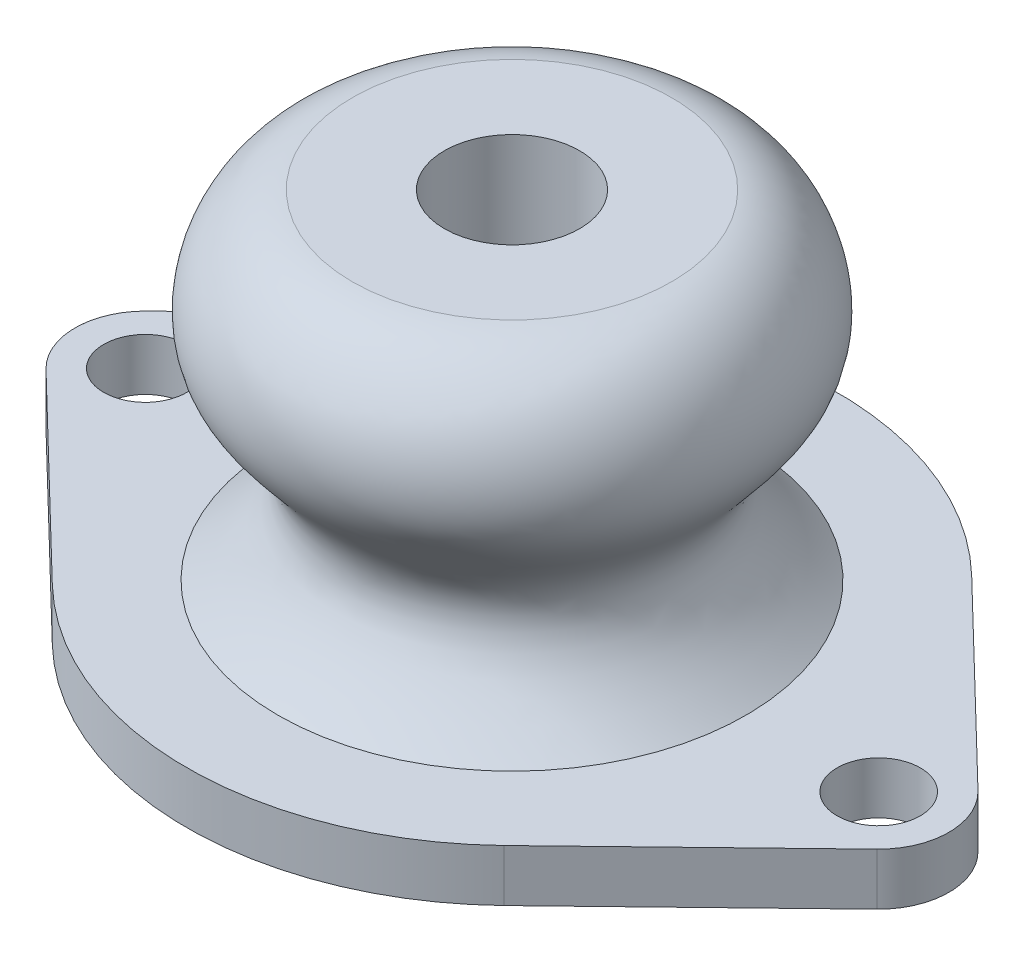
ISO-10303-21;
HEADER;
FILE_DESCRIPTION(('STEP AP214'),'2;1');
FILE_NAME('part.step','',(''),(''),'','','');
FILE_SCHEMA(('AUTOMOTIVE_DESIGN { 1 0 10303 214 1 1 1 1 }'));
ENDSEC;
DATA;
#1=APPLICATION_CONTEXT('core data for automotive mechanical design processes');
#2=APPLICATION_PROTOCOL_DEFINITION('international standard','automotive_design',2000,#1);
#3=PRODUCT_CONTEXT('',#1,'mechanical');
#4=PRODUCT('Part','Part','',(#3));
#5=PRODUCT_RELATED_PRODUCT_CATEGORY('part','',(#4));
#6=PRODUCT_DEFINITION_FORMATION('','',#4);
#7=PRODUCT_DEFINITION_CONTEXT('part definition',#1,'design');
#8=PRODUCT_DEFINITION('design','',#6,#7);
#9=PRODUCT_DEFINITION_SHAPE('','',#8);
#10=(LENGTH_UNIT() NAMED_UNIT(*) SI_UNIT(.MILLI.,.METRE.));
#11=(NAMED_UNIT(*) PLANE_ANGLE_UNIT() SI_UNIT($,.RADIAN.));
#12=(NAMED_UNIT(*) SI_UNIT($,.STERADIAN.) SOLID_ANGLE_UNIT());
#13=UNCERTAINTY_MEASURE_WITH_UNIT(LENGTH_MEASURE(1.E-05),#10,'distance_accuracy_value','');
#14=(GEOMETRIC_REPRESENTATION_CONTEXT(3) GLOBAL_UNCERTAINTY_ASSIGNED_CONTEXT((#13)) GLOBAL_UNIT_ASSIGNED_CONTEXT((#10,
#11,#12)) REPRESENTATION_CONTEXT('',''));
#15=CARTESIAN_POINT('',(0.,0.,0.));
#16=DIRECTION('',(0.,0.,1.));
#17=DIRECTION('',(1.,0.,0.));
#18=AXIS2_PLACEMENT_3D('',#15,#16,#17);
#19=CARTESIAN_POINT('',(-17.907,2.54,0.));
#20=DIRECTION('',(0.,1.,0.));
#21=DIRECTION('',(0.,0.,1.));
#22=AXIS2_PLACEMENT_3D('',#19,#20,#21);
#23=PLANE('',#22);
#24=CARTESIAN_POINT('',(-17.907,2.54,0.));
#25=DIRECTION('',(0.,1.,0.));
#26=DIRECTION('',(0.,0.,1.));
#27=AXIS2_PLACEMENT_3D('',#24,#25,#26);
#28=CIRCLE('',#27,2.032);
#29=CARTESIAN_POINT('',(-17.907,2.54,2.032));
#30=VERTEX_POINT('',#29);
#31=EDGE_CURVE('E139',#30,#30,#28,.T.);
#32=ORIENTED_EDGE('',*,*,#31,.F.);
#33=EDGE_LOOP('',(#32));
#34=FACE_BOUND('',#33,.T.);
#35=CARTESIAN_POINT('',(-17.907,2.54,0.));
#36=DIRECTION('',(0.,1.,0.));
#37=DIRECTION('',(0.,0.,1.));
#38=AXIS2_PLACEMENT_3D('',#35,#36,#37);
#39=CIRCLE('',#38,3.429);
#40=CARTESIAN_POINT('',(-20.2902765957447,2.54,-2.46536684251566));
#41=VERTEX_POINT('',#40);
#42=CARTESIAN_POINT('',(-20.2902765957447,2.54,2.46536684251566));
#43=VERTEX_POINT('',#42);
#44=EDGE_CURVE('E150',#41,#43,#39,.T.);
#45=ORIENTED_EDGE('',*,*,#44,.T.);
#46=DIRECTION('',(0.718975457134926,0.,0.695035460992908));
#47=VECTOR('',#46,1.);
#48=CARTESIAN_POINT('',(-20.2902765957447,2.54,2.46536684251566));
#49=LINE('',#48,#47);
#50=CARTESIAN_POINT('',(-11.0336879432624,2.54,11.4137353820169));
#51=VERTEX_POINT('',#50);
#52=EDGE_CURVE('E98',#43,#51,#49,.T.);
#53=ORIENTED_EDGE('',*,*,#52,.T.);
#54=CARTESIAN_POINT('',(0.,2.54,0.));
#55=DIRECTION('',(0.,1.,0.));
#56=DIRECTION('',(0.,0.,1.));
#57=AXIS2_PLACEMENT_3D('',#54,#55,#56);
#58=CIRCLE('',#57,15.875);
#59=CARTESIAN_POINT('',(11.0336879432624,2.54,11.413735382017));
#60=VERTEX_POINT('',#59);
#61=EDGE_CURVE('E215',#51,#60,#58,.T.);
#62=ORIENTED_EDGE('',*,*,#61,.T.);
#63=DIRECTION('',(0.718975457134926,0.,-0.695035460992908));
#64=VECTOR('',#63,1.);
#65=CARTESIAN_POINT('',(11.0336879432624,2.54,11.413735382017));
#66=LINE('',#65,#64);
#67=CARTESIAN_POINT('',(20.2902765957447,2.54,2.46536684251566));
#68=VERTEX_POINT('',#67);
#69=EDGE_CURVE('E221',#60,#68,#66,.T.);
#70=ORIENTED_EDGE('',*,*,#69,.T.);
#71=CARTESIAN_POINT('',(17.907,2.54,0.));
#72=DIRECTION('',(0.,1.,0.));
#73=DIRECTION('',(0.,0.,1.));
#74=AXIS2_PLACEMENT_3D('',#71,#72,#73);
#75=CIRCLE('',#74,3.429);
#76=CARTESIAN_POINT('',(20.2902765957447,2.54,-2.46536684251566));
#77=VERTEX_POINT('',#76);
#78=EDGE_CURVE('E117',#68,#77,#75,.T.);
#79=ORIENTED_EDGE('',*,*,#78,.T.);
#80=DIRECTION('',(-0.718975457134926,0.,-0.695035460992908));
#81=VECTOR('',#80,1.);
#82=CARTESIAN_POINT('',(20.2902765957447,2.54,-2.46536684251566));
#83=LINE('',#82,#81);
#84=CARTESIAN_POINT('',(11.0336879432624,2.54,-11.413735382017));
#85=VERTEX_POINT('',#84);
#86=EDGE_CURVE('E111',#77,#85,#83,.T.);
#87=ORIENTED_EDGE('',*,*,#86,.T.);
#88=CARTESIAN_POINT('',(0.,2.54,0.));
#89=DIRECTION('',(0.,1.,0.));
#90=DIRECTION('',(0.,0.,1.));
#91=AXIS2_PLACEMENT_3D('',#88,#89,#90);
#92=CIRCLE('',#91,15.875);
#93=CARTESIAN_POINT('',(-11.0336879432624,2.54,-11.413735382017));
#94=VERTEX_POINT('',#93);
#95=EDGE_CURVE('E115',#85,#94,#92,.T.);
#96=ORIENTED_EDGE('',*,*,#95,.T.);
#97=DIRECTION('',(-0.718975457134926,0.,0.695035460992908));
#98=VECTOR('',#97,1.);
#99=CARTESIAN_POINT('',(-20.2902765957447,2.54,-2.46536684251566));
#100=LINE('',#99,#98);
#101=EDGE_CURVE('E54',#94,#41,#100,.T.);
#102=ORIENTED_EDGE('',*,*,#101,.T.);
#103=EDGE_LOOP('',(#45,#53,#62,#70,#79,#87,#96,#102));
#104=FACE_BOUND('',#103,.T.);
#105=CARTESIAN_POINT('',(17.907,2.54,0.));
#106=DIRECTION('',(0.,1.,0.));
#107=DIRECTION('',(0.,0.,1.));
#108=AXIS2_PLACEMENT_3D('',#105,#106,#107);
#109=CIRCLE('',#108,2.032);
#110=CARTESIAN_POINT('',(17.907,2.54,2.03199999999999));
#111=VERTEX_POINT('',#110);
#112=EDGE_CURVE('E230',#111,#111,#109,.T.);
#113=ORIENTED_EDGE('',*,*,#112,.F.);
#114=EDGE_LOOP('',(#113));
#115=FACE_BOUND('',#114,.T.);
#116=CARTESIAN_POINT('',(0.,2.54,0.));
#117=DIRECTION('',(0.,1.,0.));
#118=DIRECTION('',(0.,0.,1.));
#119=AXIS2_PLACEMENT_3D('',#116,#117,#118);
#120=CIRCLE('',#119,11.43);
#121=CARTESIAN_POINT('',(0.,2.54,11.43));
#122=VERTEX_POINT('',#121);
#123=EDGE_CURVE('E11',#122,#122,#120,.T.);
#124=ORIENTED_EDGE('',*,*,#123,.F.);
#125=EDGE_LOOP('',(#124));
#126=FACE_BOUND('',#125,.T.);
#127=ADVANCED_FACE('F37',(#34,#104,#115,#126),#23,.T.);
#128=CARTESIAN_POINT('',(0.,2.54,0.));
#129=DIRECTION('',(0.,1.,0.));
#130=DIRECTION('',(0.,0.,1.));
#131=AXIS2_PLACEMENT_3D('',#128,#129,#130);
#132=CIRCLE('',#131,3.302);
#133=CARTESIAN_POINT('',(0.,2.54,3.302));
#134=VERTEX_POINT('',#133);
#135=EDGE_CURVE('E236',#134,#134,#132,.T.);
#136=ORIENTED_EDGE('',*,*,#135,.F.);
#137=EDGE_LOOP('',(#136));
#138=FACE_BOUND('',#137,.T.);
#139=CARTESIAN_POINT('',(0.,2.54,0.));
#140=DIRECTION('',(0.,1.,0.));
#141=DIRECTION('',(0.,0.,1.));
#142=AXIS2_PLACEMENT_3D('',#139,#140,#141);
#143=CIRCLE('',#142,7.62);
#144=CARTESIAN_POINT('',(0.,2.54,7.62));
#145=VERTEX_POINT('',#144);
#146=EDGE_CURVE('E46',#145,#145,#143,.F.);
#147=ORIENTED_EDGE('',*,*,#146,.F.);
#148=EDGE_LOOP('',(#147));
#149=FACE_BOUND('',#148,.T.);
#150=ADVANCED_FACE('F169',(#138,#149),#23,.T.);
#151=CARTESIAN_POINT('',(-17.907,0.,0.));
#152=DIRECTION('',(0.,1.,0.));
#153=DIRECTION('',(0.,0.,1.));
#154=AXIS2_PLACEMENT_3D('',#151,#152,#153);
#155=PLANE('',#154);
#156=CARTESIAN_POINT('',(-17.907,0.,0.));
#157=DIRECTION('',(0.,1.,0.));
#158=DIRECTION('',(0.,0.,1.));
#159=AXIS2_PLACEMENT_3D('',#156,#157,#158);
#160=CIRCLE('',#159,3.429);
#161=CARTESIAN_POINT('',(-20.2902765957447,0.,-2.46536684251566));
#162=VERTEX_POINT('',#161);
#163=CARTESIAN_POINT('',(-20.2902765957447,0.,2.46536684251566));
#164=VERTEX_POINT('',#163);
#165=EDGE_CURVE('E135',#162,#164,#160,.T.);
#166=ORIENTED_EDGE('',*,*,#165,.F.);
#167=DIRECTION('',(-0.718975457134926,0.,0.695035460992908));
#168=VECTOR('',#167,1.);
#169=CARTESIAN_POINT('',(-20.2902765957447,0.,-2.46536684251566));
#170=LINE('',#169,#168);
#171=CARTESIAN_POINT('',(-11.0336879432624,0.,-11.413735382017));
#172=VERTEX_POINT('',#171);
#173=EDGE_CURVE('E89',#172,#162,#170,.T.);
#174=ORIENTED_EDGE('',*,*,#173,.F.);
#175=CARTESIAN_POINT('',(0.,0.,0.));
#176=DIRECTION('',(0.,1.,0.));
#177=DIRECTION('',(0.,0.,1.));
#178=AXIS2_PLACEMENT_3D('',#175,#176,#177);
#179=CIRCLE('',#178,15.875);
#180=CARTESIAN_POINT('',(11.0336879432624,0.,-11.413735382017));
#181=VERTEX_POINT('',#180);
#182=EDGE_CURVE('E83',#181,#172,#179,.T.);
#183=ORIENTED_EDGE('',*,*,#182,.F.);
#184=DIRECTION('',(-0.718975457134926,0.,-0.695035460992908));
#185=VECTOR('',#184,1.);
#186=CARTESIAN_POINT('',(20.2902765957447,0.,-2.46536684251566));
#187=LINE('',#186,#185);
#188=CARTESIAN_POINT('',(20.2902765957447,0.,-2.46536684251566));
#189=VERTEX_POINT('',#188);
#190=EDGE_CURVE('E125',#189,#181,#187,.T.);
#191=ORIENTED_EDGE('',*,*,#190,.F.);
#192=CARTESIAN_POINT('',(17.907,0.,0.));
#193=DIRECTION('',(0.,1.,0.));
#194=DIRECTION('',(0.,0.,1.));
#195=AXIS2_PLACEMENT_3D('',#192,#193,#194);
#196=CIRCLE('',#195,3.429);
#197=CARTESIAN_POINT('',(20.2902765957447,0.,2.46536684251566));
#198=VERTEX_POINT('',#197);
#199=EDGE_CURVE('E145',#198,#189,#196,.T.);
#200=ORIENTED_EDGE('',*,*,#199,.F.);
#201=DIRECTION('',(0.718975457134926,0.,-0.695035460992908));
#202=VECTOR('',#201,1.);
#203=CARTESIAN_POINT('',(11.0336879432624,0.,11.413735382017));
#204=LINE('',#203,#202);
#205=CARTESIAN_POINT('',(11.0336879432624,0.,11.413735382017));
#206=VERTEX_POINT('',#205);
#207=EDGE_CURVE('E143',#206,#198,#204,.T.);
#208=ORIENTED_EDGE('',*,*,#207,.F.);
#209=CARTESIAN_POINT('',(0.,0.,0.));
#210=DIRECTION('',(0.,1.,0.));
#211=DIRECTION('',(0.,0.,1.));
#212=AXIS2_PLACEMENT_3D('',#209,#210,#211);
#213=CIRCLE('',#212,15.875);
#214=CARTESIAN_POINT('',(-11.0336879432624,0.,11.4137353820169));
#215=VERTEX_POINT('',#214);
#216=EDGE_CURVE('E141',#215,#206,#213,.T.);
#217=ORIENTED_EDGE('',*,*,#216,.F.);
#218=DIRECTION('',(0.718975457134926,0.,0.695035460992908));
#219=VECTOR('',#218,1.);
#220=CARTESIAN_POINT('',(-20.2902765957447,0.,2.46536684251566));
#221=LINE('',#220,#219);
#222=EDGE_CURVE('E138',#164,#215,#221,.T.);
#223=ORIENTED_EDGE('',*,*,#222,.F.);
#224=EDGE_LOOP('',(#166,#174,#183,#191,#200,#208,#217,#223));
#225=FACE_BOUND('',#224,.T.);
#226=CARTESIAN_POINT('',(-17.907,0.,0.));
#227=DIRECTION('',(0.,1.,0.));
#228=DIRECTION('',(0.,0.,1.));
#229=AXIS2_PLACEMENT_3D('',#226,#227,#228);
#230=CIRCLE('',#229,2.032);
#231=CARTESIAN_POINT('',(-17.907,0.,2.032));
#232=VERTEX_POINT('',#231);
#233=EDGE_CURVE('E227',#232,#232,#230,.T.);
#234=ORIENTED_EDGE('',*,*,#233,.T.);
#235=EDGE_LOOP('',(#234));
#236=FACE_BOUND('',#235,.T.);
#237=CARTESIAN_POINT('',(17.907,0.,0.));
#238=DIRECTION('',(0.,1.,0.));
#239=DIRECTION('',(0.,0.,1.));
#240=AXIS2_PLACEMENT_3D('',#237,#238,#239);
#241=CIRCLE('',#240,2.032);
#242=CARTESIAN_POINT('',(17.907,0.,2.03199999999999));
#243=VERTEX_POINT('',#242);
#244=EDGE_CURVE('E233',#243,#243,#241,.T.);
#245=ORIENTED_EDGE('',*,*,#244,.T.);
#246=EDGE_LOOP('',(#245));
#247=FACE_BOUND('',#246,.T.);
#248=CARTESIAN_POINT('',(0.,0.,0.));
#249=DIRECTION('',(0.,1.,0.));
#250=DIRECTION('',(0.,0.,1.));
#251=AXIS2_PLACEMENT_3D('',#248,#249,#250);
#252=CIRCLE('',#251,3.302);
#253=CARTESIAN_POINT('',(0.,0.,3.302));
#254=VERTEX_POINT('',#253);
#255=EDGE_CURVE('E239',#254,#254,#252,.T.);
#256=ORIENTED_EDGE('',*,*,#255,.T.);
#257=EDGE_LOOP('',(#256));
#258=FACE_BOUND('',#257,.T.);
#259=ADVANCED_FACE('F171',(#225,#236,#247,#258),#155,.F.);
#260=CARTESIAN_POINT('',(-17.907,2.54,0.));
#261=DIRECTION('',(0.,-1.,0.));
#262=DIRECTION('',(0.,0.,-1.));
#263=AXIS2_PLACEMENT_3D('',#260,#261,#262);
#264=CYLINDRICAL_SURFACE('',#263,3.429);
#265=ORIENTED_EDGE('',*,*,#165,.T.);
#266=DIRECTION('',(0.,-1.,0.));
#267=VECTOR('',#266,1.);
#268=CARTESIAN_POINT('',(-20.2902765957447,2.54,2.46536684251566));
#269=LINE('',#268,#267);
#270=EDGE_CURVE('E163',#43,#164,#269,.T.);
#271=ORIENTED_EDGE('',*,*,#270,.F.);
#272=ORIENTED_EDGE('',*,*,#44,.F.);
#273=DIRECTION('',(0.,-1.,0.));
#274=VECTOR('',#273,1.);
#275=CARTESIAN_POINT('',(-20.2902765957447,2.54,-2.46536684251566));
#276=LINE('',#275,#274);
#277=EDGE_CURVE('E131',#41,#162,#276,.T.);
#278=ORIENTED_EDGE('',*,*,#277,.T.);
#279=EDGE_LOOP('',(#265,#271,#272,#278));
#280=FACE_BOUND('',#279,.T.);
#281=ADVANCED_FACE('F39',(#280),#264,.T.);
#282=CARTESIAN_POINT('',(-20.2902765957447,2.54,2.46536684251566));
#283=DIRECTION('',(0.695035460992908,0.,-0.718975457134926));
#284=DIRECTION('',(-0.718975457134926,0.,-0.695035460992908));
#285=AXIS2_PLACEMENT_3D('',#282,#283,#284);
#286=PLANE('',#285);
#287=ORIENTED_EDGE('',*,*,#222,.T.);
#288=DIRECTION('',(0.,-1.,0.));
#289=VECTOR('',#288,1.);
#290=CARTESIAN_POINT('',(-11.0336879432624,2.54,11.4137353820169));
#291=LINE('',#290,#289);
#292=EDGE_CURVE('E160',#51,#215,#291,.T.);
#293=ORIENTED_EDGE('',*,*,#292,.F.);
#294=ORIENTED_EDGE('',*,*,#52,.F.);
#295=ORIENTED_EDGE('',*,*,#270,.T.);
#296=EDGE_LOOP('',(#287,#293,#294,#295));
#297=FACE_BOUND('',#296,.T.);
#298=ADVANCED_FACE('F203',(#297),#286,.F.);
#299=CARTESIAN_POINT('',(0.,2.54,0.));
#300=DIRECTION('',(0.,-1.,0.));
#301=DIRECTION('',(0.,0.,-1.));
#302=AXIS2_PLACEMENT_3D('',#299,#300,#301);
#303=CYLINDRICAL_SURFACE('',#302,15.875);
#304=ORIENTED_EDGE('',*,*,#216,.T.);
#305=DIRECTION('',(0.,-1.,0.));
#306=VECTOR('',#305,1.);
#307=CARTESIAN_POINT('',(11.0336879432624,2.54,11.413735382017));
#308=LINE('',#307,#306);
#309=EDGE_CURVE('E157',#60,#206,#308,.T.);
#310=ORIENTED_EDGE('',*,*,#309,.F.);
#311=ORIENTED_EDGE('',*,*,#61,.F.);
#312=ORIENTED_EDGE('',*,*,#292,.T.);
#313=EDGE_LOOP('',(#304,#310,#311,#312));
#314=FACE_BOUND('',#313,.T.);
#315=ADVANCED_FACE('F200',(#314),#303,.T.);
#316=CARTESIAN_POINT('',(11.0336879432624,2.54,11.413735382017));
#317=DIRECTION('',(-0.695035460992908,0.,-0.718975457134926));
#318=DIRECTION('',(-0.718975457134926,0.,0.695035460992908));
#319=AXIS2_PLACEMENT_3D('',#316,#317,#318);
#320=PLANE('',#319);
#321=ORIENTED_EDGE('',*,*,#207,.T.);
#322=DIRECTION('',(0.,-1.,0.));
#323=VECTOR('',#322,1.);
#324=CARTESIAN_POINT('',(20.2902765957447,2.54,2.46536684251566));
#325=LINE('',#324,#323);
#326=EDGE_CURVE('E154',#68,#198,#325,.T.);
#327=ORIENTED_EDGE('',*,*,#326,.F.);
#328=ORIENTED_EDGE('',*,*,#69,.F.);
#329=ORIENTED_EDGE('',*,*,#309,.T.);
#330=EDGE_LOOP('',(#321,#327,#328,#329));
#331=FACE_BOUND('',#330,.T.);
#332=ADVANCED_FACE('F196',(#331),#320,.F.);
#333=CARTESIAN_POINT('',(17.907,2.54,0.));
#334=DIRECTION('',(0.,-1.,0.));
#335=DIRECTION('',(0.,0.,-1.));
#336=AXIS2_PLACEMENT_3D('',#333,#334,#335);
#337=CYLINDRICAL_SURFACE('',#336,3.429);
#338=ORIENTED_EDGE('',*,*,#199,.T.);
#339=DIRECTION('',(0.,-1.,0.));
#340=VECTOR('',#339,1.);
#341=CARTESIAN_POINT('',(20.2902765957447,2.54,-2.46536684251566));
#342=LINE('',#341,#340);
#343=EDGE_CURVE('E126',#77,#189,#342,.T.);
#344=ORIENTED_EDGE('',*,*,#343,.F.);
#345=ORIENTED_EDGE('',*,*,#78,.F.);
#346=ORIENTED_EDGE('',*,*,#326,.T.);
#347=EDGE_LOOP('',(#338,#344,#345,#346));
#348=FACE_BOUND('',#347,.T.);
#349=ADVANCED_FACE('F193',(#348),#337,.T.);
#350=CARTESIAN_POINT('',(20.2902765957447,2.54,-2.46536684251566));
#351=DIRECTION('',(-0.695035460992908,0.,0.718975457134926));
#352=DIRECTION('',(0.718975457134926,0.,0.695035460992908));
#353=AXIS2_PLACEMENT_3D('',#350,#351,#352);
#354=PLANE('',#353);
#355=ORIENTED_EDGE('',*,*,#190,.T.);
#356=DIRECTION('',(0.,-1.,0.));
#357=VECTOR('',#356,1.);
#358=CARTESIAN_POINT('',(11.0336879432624,2.54,-11.413735382017));
#359=LINE('',#358,#357);
#360=EDGE_CURVE('E122',#85,#181,#359,.T.);
#361=ORIENTED_EDGE('',*,*,#360,.F.);
#362=ORIENTED_EDGE('',*,*,#86,.F.);
#363=ORIENTED_EDGE('',*,*,#343,.T.);
#364=EDGE_LOOP('',(#355,#361,#362,#363));
#365=FACE_BOUND('',#364,.T.);
#366=ADVANCED_FACE('F123',(#365),#354,.F.);
#367=CARTESIAN_POINT('',(0.,2.54,0.));
#368=DIRECTION('',(0.,-1.,0.));
#369=DIRECTION('',(0.,0.,-1.));
#370=AXIS2_PLACEMENT_3D('',#367,#368,#369);
#371=CYLINDRICAL_SURFACE('',#370,15.875);
#372=ORIENTED_EDGE('',*,*,#182,.T.);
#373=DIRECTION('',(0.,-1.,0.));
#374=VECTOR('',#373,1.);
#375=CARTESIAN_POINT('',(-11.0336879432624,2.54,-11.413735382017));
#376=LINE('',#375,#374);
#377=EDGE_CURVE('E127',#94,#172,#376,.T.);
#378=ORIENTED_EDGE('',*,*,#377,.F.);
#379=ORIENTED_EDGE('',*,*,#95,.F.);
#380=ORIENTED_EDGE('',*,*,#360,.T.);
#381=EDGE_LOOP('',(#372,#378,#379,#380));
#382=FACE_BOUND('',#381,.T.);
#383=ADVANCED_FACE('F129',(#382),#371,.T.);
#384=CARTESIAN_POINT('',(-20.2902765957447,2.54,-2.46536684251566));
#385=DIRECTION('',(0.695035460992908,0.,0.718975457134926));
#386=DIRECTION('',(0.718975457134926,0.,-0.695035460992908));
#387=AXIS2_PLACEMENT_3D('',#384,#385,#386);
#388=PLANE('',#387);
#389=ORIENTED_EDGE('',*,*,#173,.T.);
#390=ORIENTED_EDGE('',*,*,#277,.F.);
#391=ORIENTED_EDGE('',*,*,#101,.F.);
#392=ORIENTED_EDGE('',*,*,#377,.T.);
#393=EDGE_LOOP('',(#389,#390,#391,#392));
#394=FACE_BOUND('',#393,.T.);
#395=ADVANCED_FACE('F186',(#394),#388,.F.);
#396=CARTESIAN_POINT('',(-17.907,2.54,0.));
#397=DIRECTION('',(0.,-1.,0.));
#398=DIRECTION('',(0.,0.,-1.));
#399=AXIS2_PLACEMENT_3D('',#396,#397,#398);
#400=CYLINDRICAL_SURFACE('',#399,2.032);
#401=ORIENTED_EDGE('',*,*,#31,.T.);
#402=EDGE_LOOP('',(#401));
#403=FACE_BOUND('',#402,.T.);
#404=ORIENTED_EDGE('',*,*,#233,.F.);
#405=EDGE_LOOP('',(#404));
#406=FACE_BOUND('',#405,.T.);
#407=ADVANCED_FACE('F183',(#403,#406),#400,.F.);
#408=CARTESIAN_POINT('',(17.907,2.54,0.));
#409=DIRECTION('',(0.,-1.,0.));
#410=DIRECTION('',(0.,0.,-1.));
#411=AXIS2_PLACEMENT_3D('',#408,#409,#410);
#412=CYLINDRICAL_SURFACE('',#411,2.032);
#413=ORIENTED_EDGE('',*,*,#112,.T.);
#414=EDGE_LOOP('',(#413));
#415=FACE_BOUND('',#414,.T.);
#416=ORIENTED_EDGE('',*,*,#244,.F.);
#417=EDGE_LOOP('',(#416));
#418=FACE_BOUND('',#417,.T.);
#419=ADVANCED_FACE('F272',(#415,#418),#412,.F.);
#420=CARTESIAN_POINT('',(0.,2.54,0.));
#421=DIRECTION('',(0.,-1.,0.));
#422=DIRECTION('',(0.,0.,-1.));
#423=AXIS2_PLACEMENT_3D('',#420,#421,#422);
#424=CYLINDRICAL_SURFACE('',#423,3.302);
#425=ORIENTED_EDGE('',*,*,#135,.T.);
#426=EDGE_LOOP('',(#425));
#427=FACE_BOUND('',#426,.T.);
#428=ORIENTED_EDGE('',*,*,#255,.F.);
#429=EDGE_LOOP('',(#428));
#430=FACE_BOUND('',#429,.T.);
#431=ADVANCED_FACE('F268',(#427,#430),#424,.F.);
#432=CARTESIAN_POINT('',(0.,19.05,7.79499801170627));
#433=CARTESIAN_POINT('',(0.,18.6451014393789,10.7405967893086));
#434=CARTESIAN_POINT('',(0.,10.3958577779326,14.519445993201));
#435=CARTESIAN_POINT('',(0.,7.7619636433784,5.01849851163103));
#436=CARTESIAN_POINT('',(0.,2.54,11.43));
#437=B_SPLINE_CURVE_WITH_KNOTS('',3,(#432,#433,#434,#435,#436),.UNSPECIFIED.,.F.,.F.,(4,1,4),
(0.,0.449937677339743,1.),.UNSPECIFIED.);
#438=CARTESIAN_POINT('',(0.,19.05,0.));
#439=DIRECTION('',(0.,1.,0.));
#440=AXIS1_PLACEMENT('',#438,#439);
#441=SURFACE_OF_REVOLUTION('',#437,#440);
#442=ORIENTED_EDGE('',*,*,#123,.T.);
#443=EDGE_LOOP('',(#442));
#444=FACE_BOUND('',#443,.T.);
#445=CARTESIAN_POINT('',(0.,19.05,0.));
#446=DIRECTION('',(0.,1.,0.));
#447=DIRECTION('',(0.,0.,1.));
#448=AXIS2_PLACEMENT_3D('',#445,#446,#447);
#449=CIRCLE('',#448,7.79499801170627);
#450=CARTESIAN_POINT('',(0.,19.05,7.79499801170627));
#451=VERTEX_POINT('',#450);
#452=EDGE_CURVE('E242',#451,#451,#449,.T.);
#453=ORIENTED_EDGE('',*,*,#452,.F.);
#454=EDGE_LOOP('',(#453));
#455=FACE_BOUND('',#454,.T.);
#456=ADVANCED_FACE('F263',(#444,#455),#441,.F.);
#457=CARTESIAN_POINT('',(0.,19.05,3.302));
#458=DIRECTION('',(0.,1.,0.));
#459=DIRECTION('',(0.,0.,1.));
#460=AXIS2_PLACEMENT_3D('',#457,#458,#459);
#461=PLANE('',#460);
#462=ORIENTED_EDGE('',*,*,#452,.T.);
#463=EDGE_LOOP('',(#462));
#464=FACE_BOUND('',#463,.T.);
#465=CARTESIAN_POINT('',(0.,19.05,0.));
#466=DIRECTION('',(0.,1.,0.));
#467=DIRECTION('',(0.,0.,1.));
#468=AXIS2_PLACEMENT_3D('',#465,#466,#467);
#469=CIRCLE('',#468,3.302);
#470=CARTESIAN_POINT('',(0.,19.05,3.302));
#471=VERTEX_POINT('',#470);
#472=EDGE_CURVE('E247',#471,#471,#469,.T.);
#473=ORIENTED_EDGE('',*,*,#472,.F.);
#474=EDGE_LOOP('',(#473));
#475=FACE_BOUND('',#474,.T.);
#476=ADVANCED_FACE('F267',(#464,#475),#461,.T.);
#477=CARTESIAN_POINT('',(0.,19.05,0.));
#478=DIRECTION('',(0.,1.,0.));
#479=DIRECTION('',(0.,0.,1.));
#480=AXIS2_PLACEMENT_3D('',#477,#478,#479);
#481=CYLINDRICAL_SURFACE('',#480,3.302);
#482=ORIENTED_EDGE('',*,*,#472,.T.);
#483=EDGE_LOOP('',(#482));
#484=FACE_BOUND('',#483,.T.);
#485=CARTESIAN_POINT('',(0.,12.7,0.));
#486=DIRECTION('',(0.,1.,0.));
#487=DIRECTION('',(0.,0.,1.));
#488=AXIS2_PLACEMENT_3D('',#485,#486,#487);
#489=CIRCLE('',#488,3.302);
#490=CARTESIAN_POINT('',(0.,12.7,3.302));
#491=VERTEX_POINT('',#490);
#492=EDGE_CURVE('E250',#491,#491,#489,.T.);
#493=ORIENTED_EDGE('',*,*,#492,.F.);
#494=EDGE_LOOP('',(#493));
#495=FACE_BOUND('',#494,.T.);
#496=ADVANCED_FACE('F294',(#484,#495),#481,.F.);
#497=CARTESIAN_POINT('',(0.,12.7,3.302));
#498=DIRECTION('',(0.,-1.,0.));
#499=DIRECTION('',(0.,0.,-1.));
#500=AXIS2_PLACEMENT_3D('',#497,#498,#499);
#501=PLANE('',#500);
#502=ORIENTED_EDGE('',*,*,#492,.T.);
#503=EDGE_LOOP('',(#502));
#504=FACE_BOUND('',#503,.T.);
#505=CARTESIAN_POINT('',(0.,12.7,0.));
#506=DIRECTION('',(0.,1.,0.));
#507=DIRECTION('',(0.,0.,1.));
#508=AXIS2_PLACEMENT_3D('',#505,#506,#507);
#509=CIRCLE('',#508,7.62);
#510=CARTESIAN_POINT('',(0.,12.7,7.62));
#511=VERTEX_POINT('',#510);
#512=EDGE_CURVE('E253',#511,#511,#509,.T.);
#513=ORIENTED_EDGE('',*,*,#512,.F.);
#514=EDGE_LOOP('',(#513));
#515=FACE_BOUND('',#514,.T.);
#516=ADVANCED_FACE('F299',(#504,#515),#501,.T.);
#517=CARTESIAN_POINT('',(0.,19.05,0.));
#518=DIRECTION('',(0.,1.,0.));
#519=DIRECTION('',(0.,0.,1.));
#520=AXIS2_PLACEMENT_3D('',#517,#518,#519);
#521=CYLINDRICAL_SURFACE('',#520,7.62);
#522=ORIENTED_EDGE('',*,*,#512,.T.);
#523=EDGE_LOOP('',(#522));
#524=FACE_BOUND('',#523,.T.);
#525=ORIENTED_EDGE('',*,*,#146,.T.);
#526=EDGE_LOOP('',(#525));
#527=FACE_BOUND('',#526,.T.);
#528=ADVANCED_FACE('F167',(#524,#527),#521,.F.);
#529=CLOSED_SHELL('',(#127,#150,#259,#281,#298,#315,#332,#349,#366,#383,#395,#407,#419,#431,
#456,#476,#496,#516,#528));
#530=MANIFOLD_SOLID_BREP('B2',#529);
#531=ADVANCED_BREP_SHAPE_REPRESENTATION('',(#18,#530),#14);
#532=SHAPE_DEFINITION_REPRESENTATION(#9,#531);
ENDSEC;
END-ISO-10303-21;
